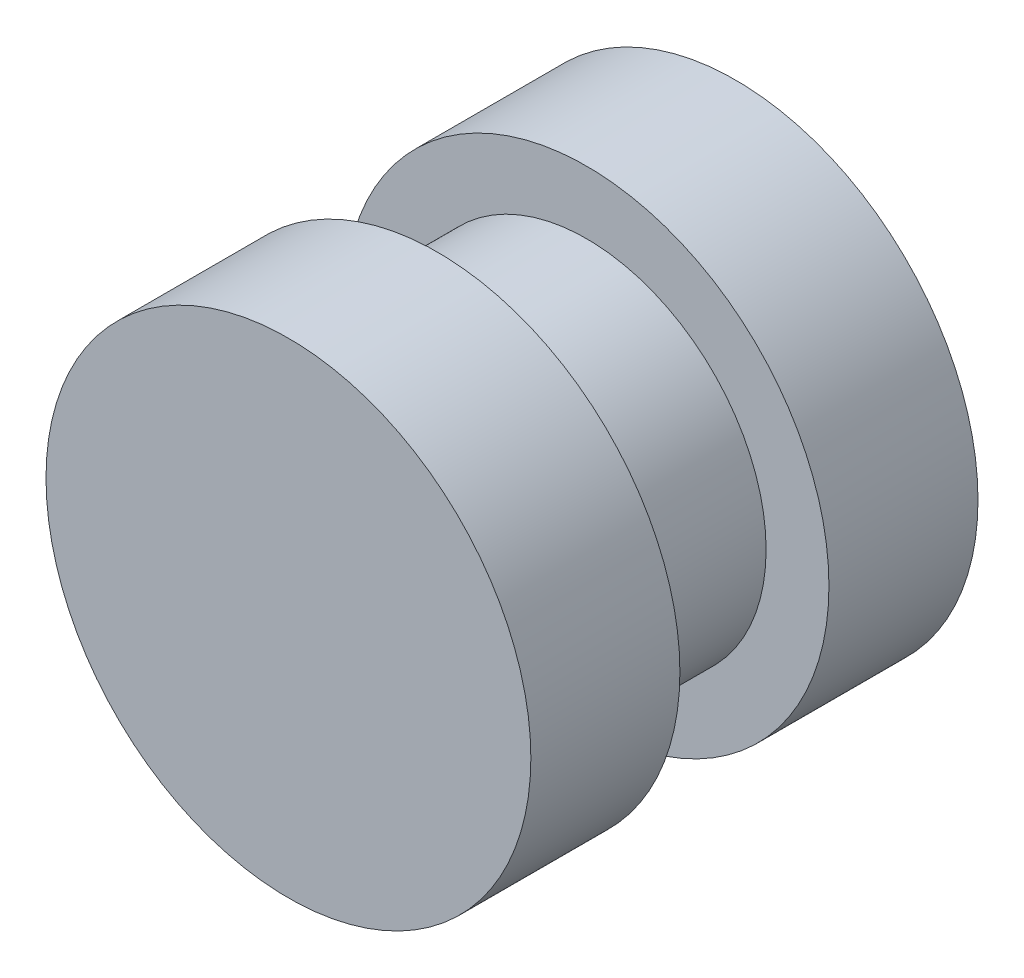
ISO-10303-21;
HEADER;
FILE_DESCRIPTION(('STEP AP214'),'2;1');
FILE_NAME('part.step','',(''),(''),'','','');
FILE_SCHEMA(('AUTOMOTIVE_DESIGN { 1 0 10303 214 1 1 1 1 }'));
ENDSEC;
DATA;
#1=APPLICATION_CONTEXT('core data for automotive mechanical design processes');
#2=APPLICATION_PROTOCOL_DEFINITION('international standard','automotive_design',2000,#1);
#3=PRODUCT_CONTEXT('',#1,'mechanical');
#4=PRODUCT('Part','Part','',(#3));
#5=PRODUCT_RELATED_PRODUCT_CATEGORY('part','',(#4));
#6=PRODUCT_DEFINITION_FORMATION('','',#4);
#7=PRODUCT_DEFINITION_CONTEXT('part definition',#1,'design');
#8=PRODUCT_DEFINITION('design','',#6,#7);
#9=PRODUCT_DEFINITION_SHAPE('','',#8);
#10=(LENGTH_UNIT() NAMED_UNIT(*) SI_UNIT(.MILLI.,.METRE.));
#11=(NAMED_UNIT(*) PLANE_ANGLE_UNIT() SI_UNIT($,.RADIAN.));
#12=(NAMED_UNIT(*) SI_UNIT($,.STERADIAN.) SOLID_ANGLE_UNIT());
#13=UNCERTAINTY_MEASURE_WITH_UNIT(LENGTH_MEASURE(1.E-05),#10,'distance_accuracy_value','');
#14=(GEOMETRIC_REPRESENTATION_CONTEXT(3) GLOBAL_UNCERTAINTY_ASSIGNED_CONTEXT((#13)) GLOBAL_UNIT_ASSIGNED_CONTEXT((#10,
#11,#12)) REPRESENTATION_CONTEXT('',''));
#15=CARTESIAN_POINT('',(0.,0.,0.));
#16=DIRECTION('',(0.,0.,1.));
#17=DIRECTION('',(1.,0.,0.));
#18=AXIS2_PLACEMENT_3D('',#15,#16,#17);
#19=CARTESIAN_POINT('',(0.,0.,8.3));
#20=DIRECTION('',(0.,0.,-1.));
#21=DIRECTION('',(-1.,0.,0.));
#22=AXIS2_PLACEMENT_3D('',#19,#20,#21);
#23=CYLINDRICAL_SURFACE('',#22,10.);
#24=CARTESIAN_POINT('',(0.,0.,8.3));
#25=DIRECTION('',(0.,0.,1.));
#26=DIRECTION('',(1.,0.,0.));
#27=AXIS2_PLACEMENT_3D('',#24,#25,#26);
#28=CIRCLE('',#27,10.);
#29=CARTESIAN_POINT('',(-10.,0.,8.3));
#30=VERTEX_POINT('',#29);
#31=EDGE_CURVE('E10',#30,#30,#28,.T.);
#32=CARTESIAN_POINT('',(0.,0.,0.));
#33=DIRECTION('',(0.,0.,1.));
#34=DIRECTION('',(1.,0.,0.));
#35=AXIS2_PLACEMENT_3D('',#32,#33,#34);
#36=CIRCLE('',#35,10.);
#37=CARTESIAN_POINT('',(-10.,0.,0.));
#38=VERTEX_POINT('',#37);
#39=EDGE_CURVE('E34',#38,#38,#36,.T.);
#40=CARTESIAN_POINT('',(-10.,0.,8.3));
#41=CARTESIAN_POINT('',(-10.,0.,8.21354166666667));
#42=CARTESIAN_POINT('',(-10.,0.,8.12708333333333));
#43=CARTESIAN_POINT('',(-10.,0.,7.95416666666667));
#44=CARTESIAN_POINT('',(-10.,0.,7.86770833333333));
#45=CARTESIAN_POINT('',(-10.,0.,7.69479166666667));
#46=CARTESIAN_POINT('',(-10.,0.,7.60833333333333));
#47=CARTESIAN_POINT('',(-10.,0.,7.43541666666667));
#48=CARTESIAN_POINT('',(-10.,0.,7.34895833333333));
#49=CARTESIAN_POINT('',(-10.,0.,7.17604166666667));
#50=CARTESIAN_POINT('',(-10.,0.,7.08958333333333));
#51=CARTESIAN_POINT('',(-10.,0.,6.91666666666667));
#52=CARTESIAN_POINT('',(-10.,0.,6.83020833333333));
#53=CARTESIAN_POINT('',(-10.,0.,6.65729166666667));
#54=CARTESIAN_POINT('',(-10.,0.,6.57083333333333));
#55=CARTESIAN_POINT('',(-10.,0.,6.39791666666667));
#56=CARTESIAN_POINT('',(-10.,0.,6.31145833333333));
#57=CARTESIAN_POINT('',(-10.,0.,6.13854166666667));
#58=CARTESIAN_POINT('',(-10.,0.,6.05208333333333));
#59=CARTESIAN_POINT('',(-10.,0.,5.87916666666667));
#60=CARTESIAN_POINT('',(-10.,0.,5.79270833333333));
#61=CARTESIAN_POINT('',(-10.,0.,5.61979166666667));
#62=CARTESIAN_POINT('',(-10.,0.,5.53333333333333));
#63=CARTESIAN_POINT('',(-10.,0.,5.36041666666667));
#64=CARTESIAN_POINT('',(-10.,0.,5.27395833333333));
#65=CARTESIAN_POINT('',(-10.,0.,5.10104166666667));
#66=CARTESIAN_POINT('',(-10.,0.,5.01458333333333));
#67=CARTESIAN_POINT('',(-10.,0.,4.84166666666667));
#68=CARTESIAN_POINT('',(-10.,0.,4.75520833333333));
#69=CARTESIAN_POINT('',(-10.,0.,4.58229166666667));
#70=CARTESIAN_POINT('',(-10.,0.,4.49583333333333));
#71=CARTESIAN_POINT('',(-10.,0.,4.32291666666667));
#72=CARTESIAN_POINT('',(-10.,0.,4.23645833333333));
#73=CARTESIAN_POINT('',(-10.,0.,4.06354166666667));
#74=CARTESIAN_POINT('',(-10.,0.,3.97708333333333));
#75=CARTESIAN_POINT('',(-10.,0.,3.80416666666667));
#76=CARTESIAN_POINT('',(-10.,0.,3.71770833333333));
#77=CARTESIAN_POINT('',(-10.,0.,3.54479166666667));
#78=CARTESIAN_POINT('',(-10.,0.,3.45833333333333));
#79=CARTESIAN_POINT('',(-10.,0.,3.28541666666667));
#80=CARTESIAN_POINT('',(-10.,0.,3.19895833333333));
#81=CARTESIAN_POINT('',(-10.,0.,3.02604166666667));
#82=CARTESIAN_POINT('',(-10.,0.,2.93958333333333));
#83=CARTESIAN_POINT('',(-10.,0.,2.76666666666667));
#84=CARTESIAN_POINT('',(-10.,0.,2.68020833333333));
#85=CARTESIAN_POINT('',(-10.,0.,2.50729166666667));
#86=CARTESIAN_POINT('',(-10.,0.,2.42083333333333));
#87=CARTESIAN_POINT('',(-10.,0.,2.24791666666667));
#88=CARTESIAN_POINT('',(-10.,0.,2.16145833333333));
#89=CARTESIAN_POINT('',(-10.,0.,1.98854166666667));
#90=CARTESIAN_POINT('',(-10.,0.,1.90208333333333));
#91=CARTESIAN_POINT('',(-10.,0.,1.72916666666667));
#92=CARTESIAN_POINT('',(-10.,0.,1.64270833333333));
#93=CARTESIAN_POINT('',(-10.,0.,1.46979166666667));
#94=CARTESIAN_POINT('',(-10.,0.,1.38333333333333));
#95=CARTESIAN_POINT('',(-10.,0.,1.21041666666667));
#96=CARTESIAN_POINT('',(-10.,0.,1.12395833333333));
#97=CARTESIAN_POINT('',(-10.,0.,0.951041666666667));
#98=CARTESIAN_POINT('',(-10.,0.,0.864583333333333));
#99=CARTESIAN_POINT('',(-10.,0.,0.691666666666667));
#100=CARTESIAN_POINT('',(-10.,0.,0.605208333333333));
#101=CARTESIAN_POINT('',(-10.,0.,0.432291666666666));
#102=CARTESIAN_POINT('',(-10.,0.,0.345833333333333));
#103=CARTESIAN_POINT('',(-10.,0.,0.172916666666666));
#104=CARTESIAN_POINT('',(-10.,0.,0.086458333333333));
#105=CARTESIAN_POINT('',(-10.,0.,0.));
#106=B_SPLINE_CURVE_WITH_KNOTS('',3,(#40,#41,#42,#43,#44,#45,#46,#47,#48,#49,#50,#51,#52,#53,
#54,#55,#56,#57,#58,#59,#60,#61,#62,#63,#64,#65,#66,#67,#68,#69,#70,#71,#72,#73,#74,#75,#76,#77,
#78,#79,#80,#81,#82,#83,#84,#85,#86,#87,#88,#89,#90,#91,#92,#93,#94,#95,#96,#97,#98,#99,#100,
#101,#102,#103,#104,#105),.UNSPECIFIED.,.F.,.F.,(4,2,2,2,2,2,2,2,2,2,2,2,2,2,2,2,2,2,2,2,2,2,2,
2,2,2,2,2,2,2,2,2,4),(0.,0.259374999999999,0.518749999999999,0.778124999999999,1.0375,1.296875,
1.55625,1.815625,2.075,2.334375,2.59375,2.853125,3.1125,3.371875,3.63125,3.890625,4.15,4.409375,
4.66875,4.928125,5.1875,5.446875,5.70625,5.965625,6.225,6.484375,6.74375,7.003125,7.2625,
7.521875,7.78125,8.040625,8.3),.UNSPECIFIED.);
#107=EDGE_CURVE('BSEAM31',#30,#38,#106,.T.);
#108=ORIENTED_EDGE('',*,*,#31,.F.);
#109=ORIENTED_EDGE('',*,*,#39,.T.);
#110=ORIENTED_EDGE('',*,*,#107,.T.);
#111=ORIENTED_EDGE('',*,*,#107,.F.);
#112=EDGE_LOOP('',(#108,#110,#109,#111));
#113=FACE_BOUND('',#112,.T.);
#114=ADVANCED_FACE('F31',(#113),#23,.T.);
#115=CARTESIAN_POINT('',(0.,0.,16.6));
#116=DIRECTION('',(0.,0.,-1.));
#117=DIRECTION('',(-1.,0.,0.));
#118=AXIS2_PLACEMENT_3D('',#115,#116,#117);
#119=CYLINDRICAL_SURFACE('',#118,13.5);
#120=CARTESIAN_POINT('',(0.,0.,16.6));
#121=DIRECTION('',(0.,0.,1.));
#122=DIRECTION('',(1.,0.,0.));
#123=AXIS2_PLACEMENT_3D('',#120,#121,#122);
#124=CIRCLE('',#123,13.5);
#125=CARTESIAN_POINT('',(-13.5,0.,16.6));
#126=VERTEX_POINT('',#125);
#127=EDGE_CURVE('E38',#126,#126,#124,.T.);
#128=CARTESIAN_POINT('',(0.,0.,8.3));
#129=DIRECTION('',(0.,0.,1.));
#130=DIRECTION('',(1.,0.,0.));
#131=AXIS2_PLACEMENT_3D('',#128,#129,#130);
#132=CIRCLE('',#131,13.5);
#133=CARTESIAN_POINT('',(-13.5,0.,8.3));
#134=VERTEX_POINT('',#133);
#135=EDGE_CURVE('E42',#134,#134,#132,.T.);
#136=CARTESIAN_POINT('',(-13.5,0.,16.6));
#137=CARTESIAN_POINT('',(-13.5,0.,16.5135416666667));
#138=CARTESIAN_POINT('',(-13.5,0.,16.4270833333333));
#139=CARTESIAN_POINT('',(-13.5,0.,16.2541666666667));
#140=CARTESIAN_POINT('',(-13.5,0.,16.1677083333333));
#141=CARTESIAN_POINT('',(-13.5,0.,15.9947916666667));
#142=CARTESIAN_POINT('',(-13.5,0.,15.9083333333333));
#143=CARTESIAN_POINT('',(-13.5,0.,15.7354166666667));
#144=CARTESIAN_POINT('',(-13.5,0.,15.6489583333333));
#145=CARTESIAN_POINT('',(-13.5,0.,15.4760416666667));
#146=CARTESIAN_POINT('',(-13.5,0.,15.3895833333333));
#147=CARTESIAN_POINT('',(-13.5,0.,15.2166666666667));
#148=CARTESIAN_POINT('',(-13.5,0.,15.1302083333333));
#149=CARTESIAN_POINT('',(-13.5,0.,14.9572916666667));
#150=CARTESIAN_POINT('',(-13.5,0.,14.8708333333333));
#151=CARTESIAN_POINT('',(-13.5,0.,14.6979166666667));
#152=CARTESIAN_POINT('',(-13.5,0.,14.6114583333333));
#153=CARTESIAN_POINT('',(-13.5,0.,14.4385416666667));
#154=CARTESIAN_POINT('',(-13.5,0.,14.3520833333333));
#155=CARTESIAN_POINT('',(-13.5,0.,14.1791666666667));
#156=CARTESIAN_POINT('',(-13.5,0.,14.0927083333333));
#157=CARTESIAN_POINT('',(-13.5,0.,13.9197916666667));
#158=CARTESIAN_POINT('',(-13.5,0.,13.8333333333333));
#159=CARTESIAN_POINT('',(-13.5,0.,13.6604166666667));
#160=CARTESIAN_POINT('',(-13.5,0.,13.5739583333333));
#161=CARTESIAN_POINT('',(-13.5,0.,13.4010416666667));
#162=CARTESIAN_POINT('',(-13.5,0.,13.3145833333333));
#163=CARTESIAN_POINT('',(-13.5,0.,13.1416666666667));
#164=CARTESIAN_POINT('',(-13.5,0.,13.0552083333333));
#165=CARTESIAN_POINT('',(-13.5,0.,12.8822916666667));
#166=CARTESIAN_POINT('',(-13.5,0.,12.7958333333333));
#167=CARTESIAN_POINT('',(-13.5,0.,12.6229166666667));
#168=CARTESIAN_POINT('',(-13.5,0.,12.5364583333333));
#169=CARTESIAN_POINT('',(-13.5,0.,12.3635416666667));
#170=CARTESIAN_POINT('',(-13.5,0.,12.2770833333333));
#171=CARTESIAN_POINT('',(-13.5,0.,12.1041666666667));
#172=CARTESIAN_POINT('',(-13.5,0.,12.0177083333333));
#173=CARTESIAN_POINT('',(-13.5,0.,11.8447916666667));
#174=CARTESIAN_POINT('',(-13.5,0.,11.7583333333333));
#175=CARTESIAN_POINT('',(-13.5,0.,11.5854166666667));
#176=CARTESIAN_POINT('',(-13.5,0.,11.4989583333333));
#177=CARTESIAN_POINT('',(-13.5,0.,11.3260416666667));
#178=CARTESIAN_POINT('',(-13.5,0.,11.2395833333333));
#179=CARTESIAN_POINT('',(-13.5,0.,11.0666666666667));
#180=CARTESIAN_POINT('',(-13.5,0.,10.9802083333333));
#181=CARTESIAN_POINT('',(-13.5,0.,10.8072916666667));
#182=CARTESIAN_POINT('',(-13.5,0.,10.7208333333333));
#183=CARTESIAN_POINT('',(-13.5,0.,10.5479166666667));
#184=CARTESIAN_POINT('',(-13.5,0.,10.4614583333333));
#185=CARTESIAN_POINT('',(-13.5,0.,10.2885416666667));
#186=CARTESIAN_POINT('',(-13.5,0.,10.2020833333333));
#187=CARTESIAN_POINT('',(-13.5,0.,10.0291666666667));
#188=CARTESIAN_POINT('',(-13.5,0.,9.94270833333333));
#189=CARTESIAN_POINT('',(-13.5,0.,9.76979166666667));
#190=CARTESIAN_POINT('',(-13.5,0.,9.68333333333333));
#191=CARTESIAN_POINT('',(-13.5,0.,9.51041666666667));
#192=CARTESIAN_POINT('',(-13.5,0.,9.42395833333333));
#193=CARTESIAN_POINT('',(-13.5,0.,9.25104166666667));
#194=CARTESIAN_POINT('',(-13.5,0.,9.16458333333333));
#195=CARTESIAN_POINT('',(-13.5,0.,8.99166666666667));
#196=CARTESIAN_POINT('',(-13.5,0.,8.90520833333333));
#197=CARTESIAN_POINT('',(-13.5,0.,8.73229166666667));
#198=CARTESIAN_POINT('',(-13.5,0.,8.64583333333333));
#199=CARTESIAN_POINT('',(-13.5,0.,8.47291666666667));
#200=CARTESIAN_POINT('',(-13.5,0.,8.38645833333333));
#201=CARTESIAN_POINT('',(-13.5,0.,8.3));
#202=B_SPLINE_CURVE_WITH_KNOTS('',3,(#136,#137,#138,#139,#140,#141,#142,#143,#144,#145,#146,
#147,#148,#149,#150,#151,#152,#153,#154,#155,#156,#157,#158,#159,#160,#161,#162,#163,#164,#165,
#166,#167,#168,#169,#170,#171,#172,#173,#174,#175,#176,#177,#178,#179,#180,#181,#182,#183,#184,
#185,#186,#187,#188,#189,#190,#191,#192,#193,#194,#195,#196,#197,#198,#199,#200,#201),
.UNSPECIFIED.,.F.,.F.,(4,2,2,2,2,2,2,2,2,2,2,2,2,2,2,2,2,2,2,2,2,2,2,2,2,2,2,2,2,2,2,2,4),(0.,
0.259375000000003,0.518750000000002,0.778125000000001,1.0375,1.296875,1.55625,1.815625,2.075,
2.334375,2.59375,2.853125,3.1125,3.371875,3.63125,3.890625,4.15,4.409375,4.66875,4.928125,
5.1875,5.446875,5.70625,5.965625,6.225,6.484375,6.74375,7.003125,7.2625,7.521875,7.78125,
8.040625,8.3),.UNSPECIFIED.);
#203=EDGE_CURVE('BSEAM79',#126,#134,#202,.T.);
#204=ORIENTED_EDGE('',*,*,#127,.F.);
#205=ORIENTED_EDGE('',*,*,#135,.T.);
#206=ORIENTED_EDGE('',*,*,#203,.T.);
#207=ORIENTED_EDGE('',*,*,#203,.F.);
#208=EDGE_LOOP('',(#204,#206,#205,#207));
#209=FACE_BOUND('',#208,.T.);
#210=ADVANCED_FACE('F79',(#209),#119,.T.);
#211=CARTESIAN_POINT('',(0.,0.,16.6));
#212=DIRECTION('',(0.,0.,1.));
#213=DIRECTION('',(1.,0.,0.));
#214=AXIS2_PLACEMENT_3D('',#211,#212,#213);
#215=PLANE('',#214);
#216=ORIENTED_EDGE('',*,*,#127,.T.);
#217=EDGE_LOOP('',(#216));
#218=FACE_BOUND('',#217,.T.);
#219=ADVANCED_FACE('F75',(#218),#215,.T.);
#220=CARTESIAN_POINT('',(0.,0.,8.3));
#221=DIRECTION('',(0.,0.,1.));
#222=DIRECTION('',(1.,0.,0.));
#223=AXIS2_PLACEMENT_3D('',#220,#221,#222);
#224=PLANE('',#223);
#225=ORIENTED_EDGE('',*,*,#31,.T.);
#226=EDGE_LOOP('',(#225));
#227=FACE_BOUND('',#226,.T.);
#228=ORIENTED_EDGE('',*,*,#135,.F.);
#229=EDGE_LOOP('',(#228));
#230=FACE_BOUND('',#229,.T.);
#231=ADVANCED_FACE('F67',(#227,#230),#224,.F.);
#232=CARTESIAN_POINT('',(0.,0.,-8.3));
#233=DIRECTION('',(0.,0.,1.));
#234=DIRECTION('',(1.,0.,0.));
#235=AXIS2_PLACEMENT_3D('',#232,#233,#234);
#236=CYLINDRICAL_SURFACE('',#235,13.5);
#237=CARTESIAN_POINT('',(0.,0.,-8.3));
#238=DIRECTION('',(0.,0.,-1.));
#239=DIRECTION('',(-1.,0.,0.));
#240=AXIS2_PLACEMENT_3D('',#237,#238,#239);
#241=CIRCLE('',#240,13.5);
#242=CARTESIAN_POINT('',(13.5,0.,-8.3));
#243=VERTEX_POINT('',#242);
#244=EDGE_CURVE('E50',#243,#243,#241,.T.);
#245=CARTESIAN_POINT('',(0.,0.,0.));
#246=DIRECTION('',(0.,0.,-1.));
#247=DIRECTION('',(-1.,0.,0.));
#248=AXIS2_PLACEMENT_3D('',#245,#246,#247);
#249=CIRCLE('',#248,13.5);
#250=CARTESIAN_POINT('',(13.5,0.,0.));
#251=VERTEX_POINT('',#250);
#252=EDGE_CURVE('E47',#251,#251,#249,.T.);
#253=CARTESIAN_POINT('',(13.5,0.,-8.3));
#254=CARTESIAN_POINT('',(13.5,0.,-8.21354166666667));
#255=CARTESIAN_POINT('',(13.5,0.,-8.12708333333333));
#256=CARTESIAN_POINT('',(13.5,0.,-7.95416666666667));
#257=CARTESIAN_POINT('',(13.5,0.,-7.86770833333333));
#258=CARTESIAN_POINT('',(13.5,0.,-7.69479166666667));
#259=CARTESIAN_POINT('',(13.5,0.,-7.60833333333333));
#260=CARTESIAN_POINT('',(13.5,0.,-7.43541666666667));
#261=CARTESIAN_POINT('',(13.5,0.,-7.34895833333333));
#262=CARTESIAN_POINT('',(13.5,0.,-7.17604166666667));
#263=CARTESIAN_POINT('',(13.5,0.,-7.08958333333333));
#264=CARTESIAN_POINT('',(13.5,0.,-6.91666666666667));
#265=CARTESIAN_POINT('',(13.5,0.,-6.83020833333333));
#266=CARTESIAN_POINT('',(13.5,0.,-6.65729166666667));
#267=CARTESIAN_POINT('',(13.5,0.,-6.57083333333333));
#268=CARTESIAN_POINT('',(13.5,0.,-6.39791666666667));
#269=CARTESIAN_POINT('',(13.5,0.,-6.31145833333333));
#270=CARTESIAN_POINT('',(13.5,0.,-6.13854166666667));
#271=CARTESIAN_POINT('',(13.5,0.,-6.05208333333333));
#272=CARTESIAN_POINT('',(13.5,0.,-5.87916666666667));
#273=CARTESIAN_POINT('',(13.5,0.,-5.79270833333333));
#274=CARTESIAN_POINT('',(13.5,0.,-5.61979166666667));
#275=CARTESIAN_POINT('',(13.5,0.,-5.53333333333333));
#276=CARTESIAN_POINT('',(13.5,0.,-5.36041666666667));
#277=CARTESIAN_POINT('',(13.5,0.,-5.27395833333333));
#278=CARTESIAN_POINT('',(13.5,0.,-5.10104166666667));
#279=CARTESIAN_POINT('',(13.5,0.,-5.01458333333333));
#280=CARTESIAN_POINT('',(13.5,0.,-4.84166666666667));
#281=CARTESIAN_POINT('',(13.5,0.,-4.75520833333333));
#282=CARTESIAN_POINT('',(13.5,0.,-4.58229166666667));
#283=CARTESIAN_POINT('',(13.5,0.,-4.49583333333333));
#284=CARTESIAN_POINT('',(13.5,0.,-4.32291666666667));
#285=CARTESIAN_POINT('',(13.5,0.,-4.23645833333333));
#286=CARTESIAN_POINT('',(13.5,0.,-4.06354166666667));
#287=CARTESIAN_POINT('',(13.5,0.,-3.97708333333333));
#288=CARTESIAN_POINT('',(13.5,0.,-3.80416666666667));
#289=CARTESIAN_POINT('',(13.5,0.,-3.71770833333333));
#290=CARTESIAN_POINT('',(13.5,0.,-3.54479166666667));
#291=CARTESIAN_POINT('',(13.5,0.,-3.45833333333333));
#292=CARTESIAN_POINT('',(13.5,0.,-3.28541666666667));
#293=CARTESIAN_POINT('',(13.5,0.,-3.19895833333333));
#294=CARTESIAN_POINT('',(13.5,0.,-3.02604166666667));
#295=CARTESIAN_POINT('',(13.5,0.,-2.93958333333333));
#296=CARTESIAN_POINT('',(13.5,0.,-2.76666666666667));
#297=CARTESIAN_POINT('',(13.5,0.,-2.68020833333333));
#298=CARTESIAN_POINT('',(13.5,0.,-2.50729166666667));
#299=CARTESIAN_POINT('',(13.5,0.,-2.42083333333333));
#300=CARTESIAN_POINT('',(13.5,0.,-2.24791666666667));
#301=CARTESIAN_POINT('',(13.5,0.,-2.16145833333333));
#302=CARTESIAN_POINT('',(13.5,0.,-1.98854166666667));
#303=CARTESIAN_POINT('',(13.5,0.,-1.90208333333333));
#304=CARTESIAN_POINT('',(13.5,0.,-1.72916666666667));
#305=CARTESIAN_POINT('',(13.5,0.,-1.64270833333333));
#306=CARTESIAN_POINT('',(13.5,0.,-1.46979166666667));
#307=CARTESIAN_POINT('',(13.5,0.,-1.38333333333333));
#308=CARTESIAN_POINT('',(13.5,0.,-1.21041666666667));
#309=CARTESIAN_POINT('',(13.5,0.,-1.12395833333333));
#310=CARTESIAN_POINT('',(13.5,0.,-0.951041666666667));
#311=CARTESIAN_POINT('',(13.5,0.,-0.864583333333333));
#312=CARTESIAN_POINT('',(13.5,0.,-0.691666666666667));
#313=CARTESIAN_POINT('',(13.5,0.,-0.605208333333333));
#314=CARTESIAN_POINT('',(13.5,0.,-0.432291666666666));
#315=CARTESIAN_POINT('',(13.5,0.,-0.345833333333333));
#316=CARTESIAN_POINT('',(13.5,0.,-0.172916666666666));
#317=CARTESIAN_POINT('',(13.5,0.,-0.086458333333333));
#318=CARTESIAN_POINT('',(13.5,0.,0.));
#319=B_SPLINE_CURVE_WITH_KNOTS('',3,(#253,#254,#255,#256,#257,#258,#259,#260,#261,#262,#263,
#264,#265,#266,#267,#268,#269,#270,#271,#272,#273,#274,#275,#276,#277,#278,#279,#280,#281,#282,
#283,#284,#285,#286,#287,#288,#289,#290,#291,#292,#293,#294,#295,#296,#297,#298,#299,#300,#301,
#302,#303,#304,#305,#306,#307,#308,#309,#310,#311,#312,#313,#314,#315,#316,#317,#318),
.UNSPECIFIED.,.F.,.F.,(4,2,2,2,2,2,2,2,2,2,2,2,2,2,2,2,2,2,2,2,2,2,2,2,2,2,2,2,2,2,2,2,4),(0.,
0.259374999999999,0.518749999999999,0.778124999999999,1.0375,1.296875,1.55625,1.815625,2.075,
2.334375,2.59375,2.853125,3.1125,3.371875,3.63125,3.890625,4.15,4.409375,4.66875,4.928125,
5.1875,5.446875,5.70625,5.965625,6.225,6.484375,6.74375,7.003125,7.2625,7.521875,7.78125,
8.040625,8.3),.UNSPECIFIED.);
#320=EDGE_CURVE('BSEAM65',#243,#251,#319,.T.);
#321=ORIENTED_EDGE('',*,*,#244,.F.);
#322=ORIENTED_EDGE('',*,*,#252,.T.);
#323=ORIENTED_EDGE('',*,*,#320,.T.);
#324=ORIENTED_EDGE('',*,*,#320,.F.);
#325=EDGE_LOOP('',(#321,#323,#322,#324));
#326=FACE_BOUND('',#325,.T.);
#327=ADVANCED_FACE('F65',(#326),#236,.T.);
#328=CARTESIAN_POINT('',(0.,0.,-8.3));
#329=DIRECTION('',(0.,0.,-1.));
#330=DIRECTION('',(-1.,0.,0.));
#331=AXIS2_PLACEMENT_3D('',#328,#329,#330);
#332=PLANE('',#331);
#333=ORIENTED_EDGE('',*,*,#244,.T.);
#334=EDGE_LOOP('',(#333));
#335=FACE_BOUND('',#334,.T.);
#336=ADVANCED_FACE('F61',(#335),#332,.T.);
#337=CARTESIAN_POINT('',(0.,0.,0.));
#338=DIRECTION('',(0.,0.,-1.));
#339=DIRECTION('',(-1.,0.,0.));
#340=AXIS2_PLACEMENT_3D('',#337,#338,#339);
#341=PLANE('',#340);
#342=ORIENTED_EDGE('',*,*,#39,.F.);
#343=EDGE_LOOP('',(#342));
#344=FACE_BOUND('',#343,.T.);
#345=ORIENTED_EDGE('',*,*,#252,.F.);
#346=EDGE_LOOP('',(#345));
#347=FACE_BOUND('',#346,.T.);
#348=ADVANCED_FACE('F58',(#344,#347),#341,.F.);
#349=CLOSED_SHELL('',(#114,#210,#219,#231,#327,#336,#348));
#350=MANIFOLD_SOLID_BREP('B2',#349);
#351=ADVANCED_BREP_SHAPE_REPRESENTATION('',(#18,#350),#14);
#352=SHAPE_DEFINITION_REPRESENTATION(#9,#351);
ENDSEC;
END-ISO-10303-21;
